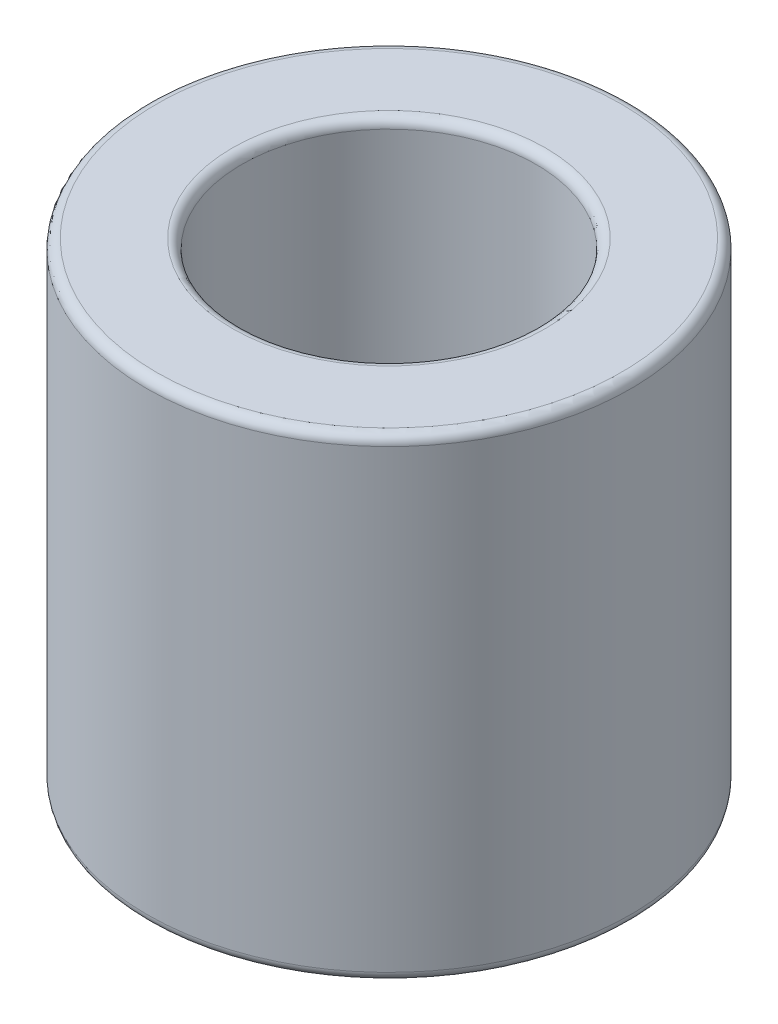
ISO-10303-21;
HEADER;
FILE_DESCRIPTION(('STEP AP214'),'2;1');
FILE_NAME('part.step','',(''),(''),'','','');
FILE_SCHEMA(('AUTOMOTIVE_DESIGN { 1 0 10303 214 1 1 1 1 }'));
ENDSEC;
DATA;
#1=APPLICATION_CONTEXT('core data for automotive mechanical design processes');
#2=APPLICATION_PROTOCOL_DEFINITION('international standard','automotive_design',2000,#1);
#3=PRODUCT_CONTEXT('',#1,'mechanical');
#4=PRODUCT('Part','Part','',(#3));
#5=PRODUCT_RELATED_PRODUCT_CATEGORY('part','',(#4));
#6=PRODUCT_DEFINITION_FORMATION('','',#4);
#7=PRODUCT_DEFINITION_CONTEXT('part definition',#1,'design');
#8=PRODUCT_DEFINITION('design','',#6,#7);
#9=PRODUCT_DEFINITION_SHAPE('','',#8);
#10=(LENGTH_UNIT() NAMED_UNIT(*) SI_UNIT(.MILLI.,.METRE.));
#11=(NAMED_UNIT(*) PLANE_ANGLE_UNIT() SI_UNIT($,.RADIAN.));
#12=(NAMED_UNIT(*) SI_UNIT($,.STERADIAN.) SOLID_ANGLE_UNIT());
#13=UNCERTAINTY_MEASURE_WITH_UNIT(LENGTH_MEASURE(1.E-05),#10,'distance_accuracy_value','');
#14=(GEOMETRIC_REPRESENTATION_CONTEXT(3) GLOBAL_UNCERTAINTY_ASSIGNED_CONTEXT((#13)) GLOBAL_UNIT_ASSIGNED_CONTEXT((#10,
#11,#12)) REPRESENTATION_CONTEXT('',''));
#15=CARTESIAN_POINT('',(0.,0.,0.));
#16=DIRECTION('',(0.,0.,1.));
#17=DIRECTION('',(1.,0.,0.));
#18=AXIS2_PLACEMENT_3D('',#15,#16,#17);
#19=CARTESIAN_POINT('',(0.,-5.,0.));
#20=DIRECTION('',(0.,1.,0.));
#21=DIRECTION('',(0.,0.,1.));
#22=AXIS2_PLACEMENT_3D('',#19,#20,#21);
#23=CYLINDRICAL_SURFACE('',#22,1.55);
#24=CARTESIAN_POINT('',(0.,-4.9,0.));
#25=DIRECTION('',(0.,1.,0.));
#26=DIRECTION('',(0.,0.,1.));
#27=AXIS2_PLACEMENT_3D('',#24,#25,#26);
#28=CIRCLE('',#27,1.55);
#29=CARTESIAN_POINT('',(0.,-4.9,1.55));
#30=VERTEX_POINT('',#29);
#31=EDGE_CURVE('E281',#30,#30,#28,.T.);
#32=ORIENTED_EDGE('',*,*,#31,.F.);
#33=EDGE_LOOP('',(#32));
#34=FACE_BOUND('',#33,.T.);
#35=CARTESIAN_POINT('',(0.,-0.1,0.));
#36=DIRECTION('',(0.,1.,0.));
#37=DIRECTION('',(0.,0.,1.));
#38=AXIS2_PLACEMENT_3D('',#35,#36,#37);
#39=CIRCLE('',#38,1.55);
#40=CARTESIAN_POINT('',(0.,-0.1,1.55));
#41=VERTEX_POINT('',#40);
#42=EDGE_CURVE('E65',#41,#41,#39,.F.);
#43=ORIENTED_EDGE('',*,*,#42,.F.);
#44=EDGE_LOOP('',(#43));
#45=FACE_BOUND('',#44,.T.);
#46=ADVANCED_FACE('F16',(#34,#45),#23,.F.);
#47=CARTESIAN_POINT('',(0.,-4.9,0.));
#48=DIRECTION('',(0.,1.,0.));
#49=DIRECTION('',(0.,0.,1.));
#50=AXIS2_PLACEMENT_3D('',#47,#48,#49);
#51=TOROIDAL_SURFACE('',#50,1.65,0.1);
#52=CARTESIAN_POINT('',(0.,-5.,0.));
#53=DIRECTION('',(0.,-1.,0.));
#54=DIRECTION('',(0.,0.,1.));
#55=AXIS2_PLACEMENT_3D('',#52,#53,#54);
#56=CIRCLE('',#55,1.65);
#57=CARTESIAN_POINT('',(0.,-5.,1.65));
#58=VERTEX_POINT('',#57);
#59=CARTESIAN_POINT('',(0.,-5.,-1.65));
#60=VERTEX_POINT('',#59);
#61=EDGE_CURVE('E59',#58,#60,#56,.T.);
#62=ORIENTED_EDGE('',*,*,#61,.T.);
#63=CARTESIAN_POINT('',(0.,-5.,0.));
#64=DIRECTION('',(0.,-1.,0.));
#65=DIRECTION('',(0.,0.,-1.));
#66=AXIS2_PLACEMENT_3D('',#63,#64,#65);
#67=CIRCLE('',#66,1.65);
#68=EDGE_CURVE('E56',#60,#58,#67,.T.);
#69=ORIENTED_EDGE('',*,*,#68,.T.);
#70=EDGE_LOOP('',(#62,#69));
#71=FACE_BOUND('',#70,.T.);
#72=ORIENTED_EDGE('',*,*,#31,.T.);
#73=EDGE_LOOP('',(#72));
#74=FACE_BOUND('',#73,.T.);
#75=ADVANCED_FACE('F60',(#71,#74),#51,.T.);
#76=CARTESIAN_POINT('',(0.,-0.1,0.));
#77=DIRECTION('',(0.,1.,0.));
#78=DIRECTION('',(0.,0.,1.));
#79=AXIS2_PLACEMENT_3D('',#76,#77,#78);
#80=TOROIDAL_SURFACE('',#79,1.65,0.1);
#81=ORIENTED_EDGE('',*,*,#42,.T.);
#82=EDGE_LOOP('',(#81));
#83=FACE_BOUND('',#82,.T.);
#84=CARTESIAN_POINT('',(0.,0.,0.));
#85=DIRECTION('',(0.,1.,0.));
#86=DIRECTION('',(0.,0.,1.));
#87=AXIS2_PLACEMENT_3D('',#84,#85,#86);
#88=CIRCLE('',#87,1.65);
#89=CARTESIAN_POINT('',(0.,0.,-1.65));
#90=VERTEX_POINT('',#89);
#91=CARTESIAN_POINT('',(0.,0.,1.65));
#92=VERTEX_POINT('',#91);
#93=EDGE_CURVE('E119',#90,#92,#88,.F.);
#94=ORIENTED_EDGE('',*,*,#93,.F.);
#95=CARTESIAN_POINT('',(0.,0.,0.));
#96=DIRECTION('',(0.,1.,0.));
#97=DIRECTION('',(0.,0.,-1.));
#98=AXIS2_PLACEMENT_3D('',#95,#96,#97);
#99=CIRCLE('',#98,1.65);
#100=EDGE_CURVE('E71',#92,#90,#99,.F.);
#101=ORIENTED_EDGE('',*,*,#100,.F.);
#102=EDGE_LOOP('',(#94,#101));
#103=FACE_BOUND('',#102,.T.);
#104=ADVANCED_FACE('F92',(#83,#103),#80,.T.);
#105=CARTESIAN_POINT('',(0.,-5.,0.));
#106=DIRECTION('',(0.,1.,0.));
#107=DIRECTION('',(0.,0.,1.));
#108=AXIS2_PLACEMENT_3D('',#105,#106,#107);
#109=PLANE('',#108);
#110=ORIENTED_EDGE('',*,*,#61,.F.);
#111=ORIENTED_EDGE('',*,*,#68,.F.);
#112=EDGE_LOOP('',(#110,#111));
#113=FACE_BOUND('',#112,.T.);
#114=CARTESIAN_POINT('',(0.,-5.,0.));
#115=DIRECTION('',(0.,1.,0.));
#116=DIRECTION('',(0.,0.,1.));
#117=AXIS2_PLACEMENT_3D('',#114,#115,#116);
#118=CIRCLE('',#117,2.45);
#119=CARTESIAN_POINT('',(0.,-5.,2.45));
#120=VERTEX_POINT('',#119);
#121=CARTESIAN_POINT('',(0.,-5.,-2.45));
#122=VERTEX_POINT('',#121);
#123=EDGE_CURVE('E115',#120,#122,#118,.T.);
#124=ORIENTED_EDGE('',*,*,#123,.F.);
#125=CARTESIAN_POINT('',(0.,-5.,0.));
#126=DIRECTION('',(0.,1.,0.));
#127=DIRECTION('',(0.,0.,-1.));
#128=AXIS2_PLACEMENT_3D('',#125,#126,#127);
#129=CIRCLE('',#128,2.45);
#130=EDGE_CURVE('E114',#122,#120,#129,.T.);
#131=ORIENTED_EDGE('',*,*,#130,.F.);
#132=EDGE_LOOP('',(#124,#131));
#133=FACE_BOUND('',#132,.T.);
#134=ADVANCED_FACE('F68',(#113,#133),#109,.F.);
#135=CARTESIAN_POINT('',(0.,0.,0.));
#136=DIRECTION('',(0.,1.,0.));
#137=DIRECTION('',(0.,0.,1.));
#138=AXIS2_PLACEMENT_3D('',#135,#136,#137);
#139=PLANE('',#138);
#140=ORIENTED_EDGE('',*,*,#100,.T.);
#141=ORIENTED_EDGE('',*,*,#93,.T.);
#142=EDGE_LOOP('',(#140,#141));
#143=FACE_BOUND('',#142,.T.);
#144=CARTESIAN_POINT('',(0.,0.,0.));
#145=DIRECTION('',(0.,-1.,0.));
#146=DIRECTION('',(0.,0.,-1.));
#147=AXIS2_PLACEMENT_3D('',#144,#145,#146);
#148=CIRCLE('',#147,2.45);
#149=CARTESIAN_POINT('',(0.,0.,-2.45));
#150=VERTEX_POINT('',#149);
#151=CARTESIAN_POINT('',(0.,0.,2.45));
#152=VERTEX_POINT('',#151);
#153=EDGE_CURVE('E122',#150,#152,#148,.T.);
#154=ORIENTED_EDGE('',*,*,#153,.F.);
#155=CARTESIAN_POINT('',(0.,0.,0.));
#156=DIRECTION('',(0.,-1.,0.));
#157=DIRECTION('',(0.,0.,1.));
#158=AXIS2_PLACEMENT_3D('',#155,#156,#157);
#159=CIRCLE('',#158,2.45);
#160=EDGE_CURVE('E35',#152,#150,#159,.T.);
#161=ORIENTED_EDGE('',*,*,#160,.F.);
#162=EDGE_LOOP('',(#154,#161));
#163=FACE_BOUND('',#162,.T.);
#164=ADVANCED_FACE('F91',(#143,#163),#139,.T.);
#165=CARTESIAN_POINT('',(0.,-4.9,0.));
#166=DIRECTION('',(0.,1.,0.));
#167=DIRECTION('',(0.,0.,1.));
#168=AXIS2_PLACEMENT_3D('',#165,#166,#167);
#169=TOROIDAL_SURFACE('',#168,2.45,0.1);
#170=CARTESIAN_POINT('',(0.,-4.9,0.));
#171=DIRECTION('',(0.,1.,0.));
#172=DIRECTION('',(0.,0.,1.));
#173=AXIS2_PLACEMENT_3D('',#170,#171,#172);
#174=CIRCLE('',#173,2.55);
#175=CARTESIAN_POINT('',(0.,-4.9,2.55));
#176=VERTEX_POINT('',#175);
#177=EDGE_CURVE('E27',#176,#176,#174,.T.);
#178=ORIENTED_EDGE('',*,*,#177,.F.);
#179=EDGE_LOOP('',(#178));
#180=FACE_BOUND('',#179,.T.);
#181=ORIENTED_EDGE('',*,*,#123,.T.);
#182=ORIENTED_EDGE('',*,*,#130,.T.);
#183=EDGE_LOOP('',(#181,#182));
#184=FACE_BOUND('',#183,.T.);
#185=ADVANCED_FACE('F120',(#180,#184),#169,.T.);
#186=CARTESIAN_POINT('',(0.,-0.1,0.));
#187=DIRECTION('',(0.,1.,0.));
#188=DIRECTION('',(0.,0.,1.));
#189=AXIS2_PLACEMENT_3D('',#186,#187,#188);
#190=TOROIDAL_SURFACE('',#189,2.45,0.1);
#191=ORIENTED_EDGE('',*,*,#160,.T.);
#192=ORIENTED_EDGE('',*,*,#153,.T.);
#193=EDGE_LOOP('',(#191,#192));
#194=FACE_BOUND('',#193,.T.);
#195=CARTESIAN_POINT('',(0.,-0.1,0.));
#196=DIRECTION('',(0.,1.,0.));
#197=DIRECTION('',(0.,0.,1.));
#198=AXIS2_PLACEMENT_3D('',#195,#196,#197);
#199=CIRCLE('',#198,2.55);
#200=CARTESIAN_POINT('',(0.,-0.1,2.55));
#201=VERTEX_POINT('',#200);
#202=EDGE_CURVE('E11',#201,#201,#199,.F.);
#203=ORIENTED_EDGE('',*,*,#202,.F.);
#204=EDGE_LOOP('',(#203));
#205=FACE_BOUND('',#204,.T.);
#206=ADVANCED_FACE('F128',(#194,#205),#190,.T.);
#207=CARTESIAN_POINT('',(0.,-5.,0.));
#208=DIRECTION('',(0.,1.,0.));
#209=DIRECTION('',(0.,0.,1.));
#210=AXIS2_PLACEMENT_3D('',#207,#208,#209);
#211=CYLINDRICAL_SURFACE('',#210,2.55);
#212=ORIENTED_EDGE('',*,*,#202,.T.);
#213=EDGE_LOOP('',(#212));
#214=FACE_BOUND('',#213,.T.);
#215=ORIENTED_EDGE('',*,*,#177,.T.);
#216=EDGE_LOOP('',(#215));
#217=FACE_BOUND('',#216,.T.);
#218=ADVANCED_FACE('F186',(#214,#217),#211,.T.);
#219=CLOSED_SHELL('',(#46,#75,#104,#134,#164,#185,#206,#218));
#220=MANIFOLD_SOLID_BREP('B1',#219);
#221=ADVANCED_BREP_SHAPE_REPRESENTATION('',(#18,#220),#14);
#222=SHAPE_DEFINITION_REPRESENTATION(#9,#221);
ENDSEC;
END-ISO-10303-21;
